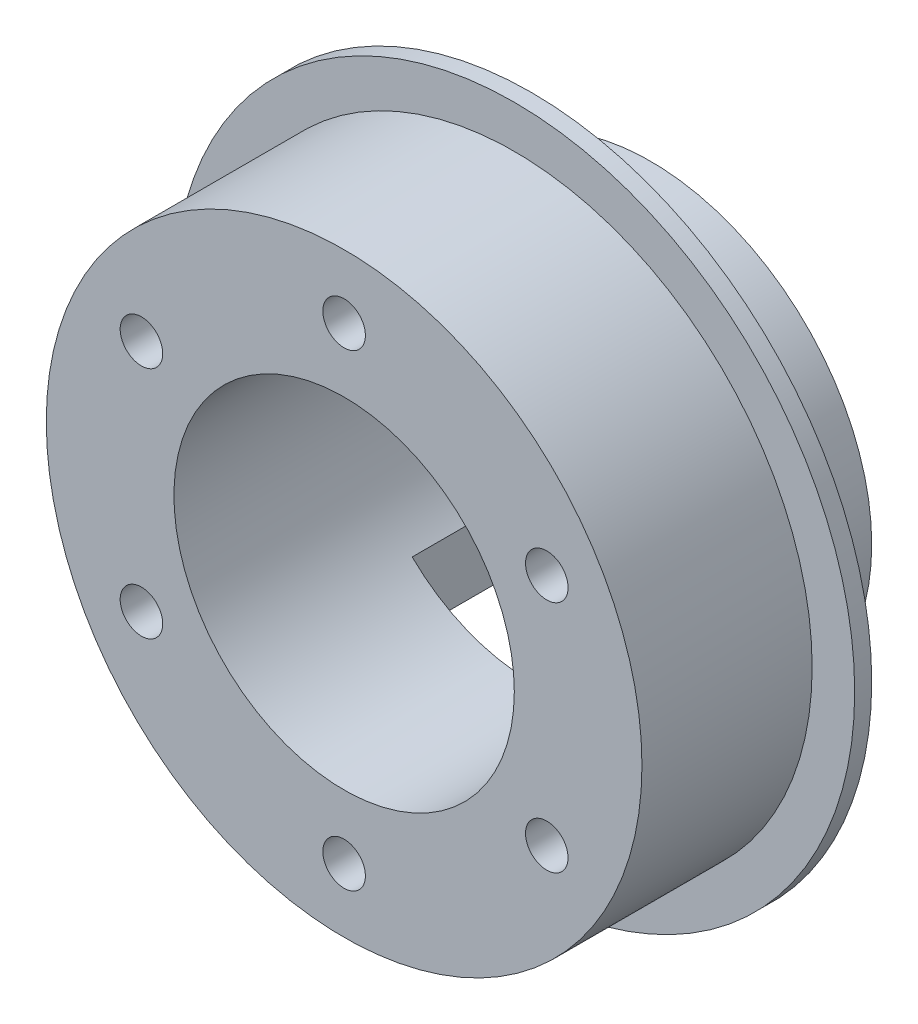
ISO-10303-21;
HEADER;
FILE_DESCRIPTION(('STEP AP214'),'2;1');
FILE_NAME('part.step','',(''),(''),'','','');
FILE_SCHEMA(('AUTOMOTIVE_DESIGN { 1 0 10303 214 1 1 1 1 }'));
ENDSEC;
DATA;
#1=APPLICATION_CONTEXT('core data for automotive mechanical design processes');
#2=APPLICATION_PROTOCOL_DEFINITION('international standard','automotive_design',2000,#1);
#3=PRODUCT_CONTEXT('',#1,'mechanical');
#4=PRODUCT('Part','Part','',(#3));
#5=PRODUCT_RELATED_PRODUCT_CATEGORY('part','',(#4));
#6=PRODUCT_DEFINITION_FORMATION('','',#4);
#7=PRODUCT_DEFINITION_CONTEXT('part definition',#1,'design');
#8=PRODUCT_DEFINITION('design','',#6,#7);
#9=PRODUCT_DEFINITION_SHAPE('','',#8);
#10=(LENGTH_UNIT() NAMED_UNIT(*) SI_UNIT(.MILLI.,.METRE.));
#11=(NAMED_UNIT(*) PLANE_ANGLE_UNIT() SI_UNIT($,.RADIAN.));
#12=(NAMED_UNIT(*) SI_UNIT($,.STERADIAN.) SOLID_ANGLE_UNIT());
#13=UNCERTAINTY_MEASURE_WITH_UNIT(LENGTH_MEASURE(1.E-05),#10,'distance_accuracy_value','');
#14=(GEOMETRIC_REPRESENTATION_CONTEXT(3) GLOBAL_UNCERTAINTY_ASSIGNED_CONTEXT((#13)) GLOBAL_UNIT_ASSIGNED_CONTEXT((#10,
#11,#12)) REPRESENTATION_CONTEXT('',''));
#15=CARTESIAN_POINT('',(0.,0.,0.));
#16=DIRECTION('',(0.,0.,1.));
#17=DIRECTION('',(1.,0.,0.));
#18=AXIS2_PLACEMENT_3D('',#15,#16,#17);
#19=CARTESIAN_POINT('',(0.,0.,8.));
#20=DIRECTION('',(0.,0.,1.));
#21=DIRECTION('',(1.,0.,0.));
#22=AXIS2_PLACEMENT_3D('',#19,#20,#21);
#23=PLANE('',#22);
#24=CARTESIAN_POINT('',(0.,0.,8.));
#25=DIRECTION('',(0.,0.,1.));
#26=DIRECTION('',(1.,0.,0.));
#27=AXIS2_PLACEMENT_3D('',#24,#25,#26);
#28=CIRCLE('',#27,17.5);
#29=CARTESIAN_POINT('',(17.5,0.,8.));
#30=VERTEX_POINT('',#29);
#31=EDGE_CURVE('E131',#30,#30,#28,.T.);
#32=ORIENTED_EDGE('',*,*,#31,.F.);
#33=EDGE_LOOP('',(#32));
#34=FACE_BOUND('',#33,.T.);
#35=CARTESIAN_POINT('',(0.,0.,8.));
#36=DIRECTION('',(0.,0.,1.));
#37=DIRECTION('',(1.,0.,0.));
#38=AXIS2_PLACEMENT_3D('',#35,#36,#37);
#39=CIRCLE('',#38,20.);
#40=CARTESIAN_POINT('',(20.,0.,8.));
#41=VERTEX_POINT('',#40);
#42=EDGE_CURVE('E314',#41,#41,#39,.T.);
#43=ORIENTED_EDGE('',*,*,#42,.T.);
#44=EDGE_LOOP('',(#43));
#45=FACE_BOUND('',#44,.T.);
#46=ADVANCED_FACE('F47',(#34,#45),#23,.T.);
#47=CARTESIAN_POINT('',(0.,0.,7.));
#48=DIRECTION('',(0.,0.,1.));
#49=DIRECTION('',(1.,0.,0.));
#50=AXIS2_PLACEMENT_3D('',#47,#48,#49);
#51=PLANE('',#50);
#52=DIRECTION('',(0.,1.,0.));
#53=VECTOR('',#52,1.);
#54=CARTESIAN_POINT('',(7.,-20.,7.));
#55=LINE('',#54,#53);
#56=CARTESIAN_POINT('',(7.,-10.9544511501033,7.));
#57=VERTEX_POINT('',#56);
#58=CARTESIAN_POINT('',(7.,-7.14142842854285,7.));
#59=VERTEX_POINT('',#58);
#60=EDGE_CURVE('E223',#57,#59,#55,.T.);
#61=ORIENTED_EDGE('',*,*,#60,.F.);
#62=CARTESIAN_POINT('',(0.,0.,7.));
#63=DIRECTION('',(0.,0.,1.));
#64=DIRECTION('',(1.,0.,0.));
#65=AXIS2_PLACEMENT_3D('',#62,#63,#64);
#66=CIRCLE('',#65,13.);
#67=CARTESIAN_POINT('',(7.,10.9544511501033,7.));
#68=VERTEX_POINT('',#67);
#69=EDGE_CURVE('E318',#57,#68,#66,.T.);
#70=ORIENTED_EDGE('',*,*,#69,.T.);
#71=CARTESIAN_POINT('',(7.,7.14142842854285,7.));
#72=VERTEX_POINT('',#71);
#73=EDGE_CURVE('E203',#72,#68,#55,.T.);
#74=ORIENTED_EDGE('',*,*,#73,.F.);
#75=CARTESIAN_POINT('',(0.,0.,7.));
#76=DIRECTION('',(0.,0.,1.));
#77=DIRECTION('',(1.,0.,0.));
#78=AXIS2_PLACEMENT_3D('',#75,#76,#77);
#79=CIRCLE('',#78,10.);
#80=CARTESIAN_POINT('',(-7.,7.14142842854285,7.));
#81=VERTEX_POINT('',#80);
#82=EDGE_CURVE('E56',#72,#81,#79,.T.);
#83=ORIENTED_EDGE('',*,*,#82,.T.);
#84=DIRECTION('',(0.,1.,0.));
#85=VECTOR('',#84,1.);
#86=CARTESIAN_POINT('',(-7.,-20.,7.));
#87=LINE('',#86,#85);
#88=CARTESIAN_POINT('',(-7.,10.9544511501033,7.));
#89=VERTEX_POINT('',#88);
#90=EDGE_CURVE('E117',#81,#89,#87,.T.);
#91=ORIENTED_EDGE('',*,*,#90,.T.);
#92=CARTESIAN_POINT('',(-7.,-10.9544511501033,7.));
#93=VERTEX_POINT('',#92);
#94=EDGE_CURVE('E322',#89,#93,#66,.T.);
#95=ORIENTED_EDGE('',*,*,#94,.T.);
#96=CARTESIAN_POINT('',(-7.,-7.14142842854285,7.));
#97=VERTEX_POINT('',#96);
#98=EDGE_CURVE('E208',#93,#97,#87,.T.);
#99=ORIENTED_EDGE('',*,*,#98,.T.);
#100=EDGE_CURVE('E129',#97,#59,#79,.T.);
#101=ORIENTED_EDGE('',*,*,#100,.T.);
#102=EDGE_LOOP('',(#61,#70,#74,#83,#91,#95,#99,#101));
#103=FACE_BOUND('',#102,.T.);
#104=CARTESIAN_POINT('',(0.,0.,7.));
#105=DIRECTION('',(0.,0.,1.));
#106=DIRECTION('',(1.,0.,0.));
#107=AXIS2_PLACEMENT_3D('',#104,#105,#106);
#108=CIRCLE('',#107,20.);
#109=CARTESIAN_POINT('',(20.,0.,7.));
#110=VERTEX_POINT('',#109);
#111=EDGE_CURVE('E312',#110,#110,#108,.T.);
#112=ORIENTED_EDGE('',*,*,#111,.F.);
#113=EDGE_LOOP('',(#112));
#114=FACE_BOUND('',#113,.T.);
#115=ADVANCED_FACE('F198',(#103,#114),#51,.F.);
#116=CARTESIAN_POINT('',(0.,0.,8.));
#117=DIRECTION('',(0.,0.,-1.));
#118=DIRECTION('',(-1.,0.,0.));
#119=AXIS2_PLACEMENT_3D('',#116,#117,#118);
#120=CYLINDRICAL_SURFACE('',#119,20.);
#121=ORIENTED_EDGE('',*,*,#42,.F.);
#122=EDGE_LOOP('',(#121));
#123=FACE_BOUND('',#122,.T.);
#124=ORIENTED_EDGE('',*,*,#111,.T.);
#125=EDGE_LOOP('',(#124));
#126=FACE_BOUND('',#125,.T.);
#127=ADVANCED_FACE('F332',(#123,#126),#120,.T.);
#128=CARTESIAN_POINT('',(0.,0.,0.));
#129=DIRECTION('',(0.,0.,1.));
#130=DIRECTION('',(1.,0.,0.));
#131=AXIS2_PLACEMENT_3D('',#128,#129,#130);
#132=PLANE('',#131);
#133=CARTESIAN_POINT('',(0.,7.,0.));
#134=DIRECTION('',(0.,0.,-1.));
#135=DIRECTION('',(-1.,0.,0.));
#136=AXIS2_PLACEMENT_3D('',#133,#134,#135);
#137=CIRCLE('',#136,1.);
#138=CARTESIAN_POINT('',(-1.,7.,0.));
#139=VERTEX_POINT('',#138);
#140=EDGE_CURVE('E156',#139,#139,#137,.T.);
#141=ORIENTED_EDGE('',*,*,#140,.F.);
#142=EDGE_LOOP('',(#141));
#143=FACE_BOUND('',#142,.T.);
#144=CARTESIAN_POINT('',(0.,0.,0.));
#145=DIRECTION('',(0.,0.,-1.));
#146=DIRECTION('',(-1.,0.,0.));
#147=AXIS2_PLACEMENT_3D('',#144,#145,#146);
#148=CIRCLE('',#147,3.);
#149=CARTESIAN_POINT('',(-3.,0.,0.));
#150=VERTEX_POINT('',#149);
#151=EDGE_CURVE('E239',#150,#150,#148,.T.);
#152=ORIENTED_EDGE('',*,*,#151,.F.);
#153=EDGE_LOOP('',(#152));
#154=FACE_BOUND('',#153,.T.);
#155=CARTESIAN_POINT('',(0.,-7.,0.));
#156=DIRECTION('',(0.,0.,-1.));
#157=DIRECTION('',(-1.,0.,0.));
#158=AXIS2_PLACEMENT_3D('',#155,#156,#157);
#159=CIRCLE('',#158,1.);
#160=CARTESIAN_POINT('',(-1.,-7.,0.));
#161=VERTEX_POINT('',#160);
#162=EDGE_CURVE('E243',#161,#161,#159,.T.);
#163=ORIENTED_EDGE('',*,*,#162,.F.);
#164=EDGE_LOOP('',(#163));
#165=FACE_BOUND('',#164,.T.);
#166=CARTESIAN_POINT('',(7.,3.,0.));
#167=DIRECTION('',(0.,0.,-1.));
#168=DIRECTION('',(-1.,0.,0.));
#169=AXIS2_PLACEMENT_3D('',#166,#167,#168);
#170=CIRCLE('',#169,1.);
#171=CARTESIAN_POINT('',(6.,3.,0.));
#172=VERTEX_POINT('',#171);
#173=EDGE_CURVE('E247',#172,#172,#170,.T.);
#174=ORIENTED_EDGE('',*,*,#173,.F.);
#175=EDGE_LOOP('',(#174));
#176=FACE_BOUND('',#175,.T.);
#177=CARTESIAN_POINT('',(7.,-3.,0.));
#178=DIRECTION('',(0.,0.,-1.));
#179=DIRECTION('',(-1.,0.,0.));
#180=AXIS2_PLACEMENT_3D('',#177,#178,#179);
#181=CIRCLE('',#180,1.);
#182=CARTESIAN_POINT('',(6.,-3.,0.));
#183=VERTEX_POINT('',#182);
#184=EDGE_CURVE('E251',#183,#183,#181,.T.);
#185=ORIENTED_EDGE('',*,*,#184,.F.);
#186=EDGE_LOOP('',(#185));
#187=FACE_BOUND('',#186,.T.);
#188=CARTESIAN_POINT('',(-7.,3.,0.));
#189=DIRECTION('',(0.,0.,-1.));
#190=DIRECTION('',(-1.,0.,0.));
#191=AXIS2_PLACEMENT_3D('',#188,#189,#190);
#192=CIRCLE('',#191,1.);
#193=CARTESIAN_POINT('',(-8.,3.,0.));
#194=VERTEX_POINT('',#193);
#195=EDGE_CURVE('E255',#194,#194,#192,.T.);
#196=ORIENTED_EDGE('',*,*,#195,.F.);
#197=EDGE_LOOP('',(#196));
#198=FACE_BOUND('',#197,.T.);
#199=CARTESIAN_POINT('',(-7.,-3.,0.));
#200=DIRECTION('',(0.,0.,-1.));
#201=DIRECTION('',(-1.,0.,0.));
#202=AXIS2_PLACEMENT_3D('',#199,#200,#201);
#203=CIRCLE('',#202,1.);
#204=CARTESIAN_POINT('',(-8.,-3.,0.));
#205=VERTEX_POINT('',#204);
#206=EDGE_CURVE('E235',#205,#205,#203,.T.);
#207=ORIENTED_EDGE('',*,*,#206,.F.);
#208=EDGE_LOOP('',(#207));
#209=FACE_BOUND('',#208,.T.);
#210=CARTESIAN_POINT('',(0.,0.,0.));
#211=DIRECTION('',(0.,0.,1.));
#212=DIRECTION('',(1.,0.,0.));
#213=AXIS2_PLACEMENT_3D('',#210,#211,#212);
#214=CIRCLE('',#213,13.);
#215=CARTESIAN_POINT('',(13.,0.,0.));
#216=VERTEX_POINT('',#215);
#217=EDGE_CURVE('E147',#216,#216,#214,.T.);
#218=ORIENTED_EDGE('',*,*,#217,.F.);
#219=EDGE_LOOP('',(#218));
#220=FACE_BOUND('',#219,.T.);
#221=ADVANCED_FACE('F330',(#143,#154,#165,#176,#187,#198,#209,#220),#132,.F.);
#222=CARTESIAN_POINT('',(0.,0.,2.));
#223=DIRECTION('',(0.,0.,-1.));
#224=DIRECTION('',(-1.,0.,0.));
#225=AXIS2_PLACEMENT_3D('',#222,#223,#224);
#226=CYLINDRICAL_SURFACE('',#225,13.);
#227=CARTESIAN_POINT('',(0.,0.,2.));
#228=DIRECTION('',(0.,0.,-1.));
#229=DIRECTION('',(-1.,0.,0.));
#230=AXIS2_PLACEMENT_3D('',#227,#228,#229);
#231=CIRCLE('',#230,13.);
#232=CARTESIAN_POINT('',(-7.,10.9544511501033,2.));
#233=VERTEX_POINT('',#232);
#234=CARTESIAN_POINT('',(7.,10.9544511501033,2.));
#235=VERTEX_POINT('',#234);
#236=EDGE_CURVE('E222',#233,#235,#231,.T.);
#237=ORIENTED_EDGE('',*,*,#236,.T.);
#238=DIRECTION('',(0.,0.,-1.));
#239=VECTOR('',#238,1.);
#240=CARTESIAN_POINT('',(7.,10.9544511501033,2.));
#241=LINE('',#240,#239);
#242=EDGE_CURVE('E228',#235,#68,#241,.F.);
#243=ORIENTED_EDGE('',*,*,#242,.T.);
#244=ORIENTED_EDGE('',*,*,#69,.F.);
#245=DIRECTION('',(0.,0.,-1.));
#246=VECTOR('',#245,1.);
#247=CARTESIAN_POINT('',(7.,-10.9544511501033,2.));
#248=LINE('',#247,#246);
#249=CARTESIAN_POINT('',(7.,-10.9544511501033,2.));
#250=VERTEX_POINT('',#249);
#251=EDGE_CURVE('E231',#57,#250,#248,.T.);
#252=ORIENTED_EDGE('',*,*,#251,.T.);
#253=CARTESIAN_POINT('',(-7.,-10.9544511501033,2.));
#254=VERTEX_POINT('',#253);
#255=EDGE_CURVE('E219',#250,#254,#231,.T.);
#256=ORIENTED_EDGE('',*,*,#255,.T.);
#257=DIRECTION('',(0.,0.,-1.));
#258=VECTOR('',#257,1.);
#259=CARTESIAN_POINT('',(-7.,-10.9544511501033,2.));
#260=LINE('',#259,#258);
#261=EDGE_CURVE('E114',#254,#93,#260,.F.);
#262=ORIENTED_EDGE('',*,*,#261,.T.);
#263=ORIENTED_EDGE('',*,*,#94,.F.);
#264=DIRECTION('',(0.,0.,-1.));
#265=VECTOR('',#264,1.);
#266=CARTESIAN_POINT('',(-7.,10.9544511501033,2.));
#267=LINE('',#266,#265);
#268=EDGE_CURVE('E206',#89,#233,#267,.T.);
#269=ORIENTED_EDGE('',*,*,#268,.T.);
#270=EDGE_LOOP('',(#237,#243,#244,#252,#256,#262,#263,#269));
#271=FACE_BOUND('',#270,.T.);
#272=ORIENTED_EDGE('',*,*,#217,.T.);
#273=EDGE_LOOP('',(#272));
#274=FACE_BOUND('',#273,.T.);
#275=ADVANCED_FACE('F49',(#271,#274),#226,.T.);
#276=CARTESIAN_POINT('',(0.,0.,18.));
#277=DIRECTION('',(0.,0.,1.));
#278=DIRECTION('',(1.,0.,0.));
#279=AXIS2_PLACEMENT_3D('',#276,#277,#278);
#280=PLANE('',#279);
#281=CARTESIAN_POINT('',(0.,13.75,18.));
#282=DIRECTION('',(0.,0.,1.));
#283=DIRECTION('',(1.,0.,0.));
#284=AXIS2_PLACEMENT_3D('',#281,#282,#283);
#285=CIRCLE('',#284,1.25);
#286=CARTESIAN_POINT('',(1.25,13.75,18.));
#287=VERTEX_POINT('',#286);
#288=EDGE_CURVE('E267',#287,#287,#285,.T.);
#289=ORIENTED_EDGE('',*,*,#288,.F.);
#290=EDGE_LOOP('',(#289));
#291=FACE_BOUND('',#290,.T.);
#292=CARTESIAN_POINT('',(-11.907849302036,6.87500000000014,18.));
#293=DIRECTION('',(0.,0.,1.));
#294=DIRECTION('',(1.,0.,0.));
#295=AXIS2_PLACEMENT_3D('',#292,#293,#294);
#296=CIRCLE('',#295,1.25);
#297=CARTESIAN_POINT('',(-10.657849302036,6.87500000000014,18.));
#298=VERTEX_POINT('',#297);
#299=EDGE_CURVE('E272',#298,#298,#296,.T.);
#300=ORIENTED_EDGE('',*,*,#299,.F.);
#301=EDGE_LOOP('',(#300));
#302=FACE_BOUND('',#301,.T.);
#303=CARTESIAN_POINT('',(-11.9078493020361,-6.87499999999989,18.));
#304=DIRECTION('',(0.,0.,1.));
#305=DIRECTION('',(1.,0.,0.));
#306=AXIS2_PLACEMENT_3D('',#303,#304,#305);
#307=CIRCLE('',#306,1.25);
#308=CARTESIAN_POINT('',(-10.6578493020361,-6.87499999999989,18.));
#309=VERTEX_POINT('',#308);
#310=EDGE_CURVE('E300',#309,#309,#307,.T.);
#311=ORIENTED_EDGE('',*,*,#310,.F.);
#312=EDGE_LOOP('',(#311));
#313=FACE_BOUND('',#312,.T.);
#314=CARTESIAN_POINT('',(0.,-13.75,18.));
#315=DIRECTION('',(0.,0.,1.));
#316=DIRECTION('',(1.,0.,0.));
#317=AXIS2_PLACEMENT_3D('',#314,#315,#316);
#318=CIRCLE('',#317,1.25);
#319=CARTESIAN_POINT('',(1.2499999999999,-13.75,18.));
#320=VERTEX_POINT('',#319);
#321=EDGE_CURVE('E294',#320,#320,#318,.T.);
#322=ORIENTED_EDGE('',*,*,#321,.F.);
#323=EDGE_LOOP('',(#322));
#324=FACE_BOUND('',#323,.T.);
#325=CARTESIAN_POINT('',(11.907849302036,-6.87500000000006,18.));
#326=DIRECTION('',(0.,0.,1.));
#327=DIRECTION('',(1.,0.,0.));
#328=AXIS2_PLACEMENT_3D('',#325,#326,#327);
#329=CIRCLE('',#328,1.25);
#330=CARTESIAN_POINT('',(13.157849302036,-6.87500000000006,18.));
#331=VERTEX_POINT('',#330);
#332=EDGE_CURVE('E286',#331,#331,#329,.T.);
#333=ORIENTED_EDGE('',*,*,#332,.F.);
#334=EDGE_LOOP('',(#333));
#335=FACE_BOUND('',#334,.T.);
#336=CARTESIAN_POINT('',(11.907849302036,6.87499999999997,18.));
#337=DIRECTION('',(0.,0.,1.));
#338=DIRECTION('',(1.,0.,0.));
#339=AXIS2_PLACEMENT_3D('',#336,#337,#338);
#340=CIRCLE('',#339,1.25);
#341=CARTESIAN_POINT('',(13.157849302036,6.87499999999997,18.));
#342=VERTEX_POINT('',#341);
#343=EDGE_CURVE('E271',#342,#342,#340,.T.);
#344=ORIENTED_EDGE('',*,*,#343,.F.);
#345=EDGE_LOOP('',(#344));
#346=FACE_BOUND('',#345,.T.);
#347=CARTESIAN_POINT('',(0.,0.,18.));
#348=DIRECTION('',(0.,0.,1.));
#349=DIRECTION('',(1.,0.,0.));
#350=AXIS2_PLACEMENT_3D('',#347,#348,#349);
#351=CIRCLE('',#350,17.5);
#352=CARTESIAN_POINT('',(17.5,0.,18.));
#353=VERTEX_POINT('',#352);
#354=EDGE_CURVE('E309',#353,#353,#351,.T.);
#355=ORIENTED_EDGE('',*,*,#354,.T.);
#356=EDGE_LOOP('',(#355));
#357=FACE_BOUND('',#356,.T.);
#358=CARTESIAN_POINT('',(0.,0.,18.));
#359=DIRECTION('',(0.,0.,1.));
#360=DIRECTION('',(1.,0.,0.));
#361=AXIS2_PLACEMENT_3D('',#358,#359,#360);
#362=CIRCLE('',#361,10.);
#363=CARTESIAN_POINT('',(10.,0.,18.));
#364=VERTEX_POINT('',#363);
#365=EDGE_CURVE('E266',#364,#364,#362,.T.);
#366=ORIENTED_EDGE('',*,*,#365,.F.);
#367=EDGE_LOOP('',(#366));
#368=FACE_BOUND('',#367,.T.);
#369=ADVANCED_FACE('F337',(#291,#302,#313,#324,#335,#346,#357,#368),#280,.T.);
#370=CARTESIAN_POINT('',(0.,0.,18.));
#371=DIRECTION('',(0.,0.,-1.));
#372=DIRECTION('',(-1.,0.,0.));
#373=AXIS2_PLACEMENT_3D('',#370,#371,#372);
#374=CYLINDRICAL_SURFACE('',#373,17.5);
#375=ORIENTED_EDGE('',*,*,#354,.F.);
#376=EDGE_LOOP('',(#375));
#377=FACE_BOUND('',#376,.T.);
#378=ORIENTED_EDGE('',*,*,#31,.T.);
#379=EDGE_LOOP('',(#378));
#380=FACE_BOUND('',#379,.T.);
#381=ADVANCED_FACE('F353',(#377,#380),#374,.T.);
#382=CARTESIAN_POINT('',(0.,0.,2.));
#383=DIRECTION('',(0.,0.,1.));
#384=DIRECTION('',(1.,0.,0.));
#385=AXIS2_PLACEMENT_3D('',#382,#383,#384);
#386=PLANE('',#385);
#387=CARTESIAN_POINT('',(7.,-3.,2.));
#388=DIRECTION('',(0.,0.,1.));
#389=DIRECTION('',(1.,0.,0.));
#390=AXIS2_PLACEMENT_3D('',#387,#388,#389);
#391=CIRCLE('',#390,1.);
#392=CARTESIAN_POINT('',(8.,-3.,2.));
#393=VERTEX_POINT('',#392);
#394=EDGE_CURVE('E160',#393,#393,#391,.T.);
#395=ORIENTED_EDGE('',*,*,#394,.F.);
#396=EDGE_LOOP('',(#395));
#397=FACE_BOUND('',#396,.T.);
#398=CARTESIAN_POINT('',(7.,3.,2.));
#399=DIRECTION('',(0.,0.,1.));
#400=DIRECTION('',(1.,0.,0.));
#401=AXIS2_PLACEMENT_3D('',#398,#399,#400);
#402=CIRCLE('',#401,1.);
#403=CARTESIAN_POINT('',(8.,3.,2.));
#404=VERTEX_POINT('',#403);
#405=EDGE_CURVE('E164',#404,#404,#402,.T.);
#406=ORIENTED_EDGE('',*,*,#405,.F.);
#407=EDGE_LOOP('',(#406));
#408=FACE_BOUND('',#407,.T.);
#409=CARTESIAN_POINT('',(-7.,3.,2.));
#410=DIRECTION('',(0.,0.,1.));
#411=DIRECTION('',(1.,0.,0.));
#412=AXIS2_PLACEMENT_3D('',#409,#410,#411);
#413=CIRCLE('',#412,1.);
#414=CARTESIAN_POINT('',(-6.,3.,2.));
#415=VERTEX_POINT('',#414);
#416=EDGE_CURVE('E155',#415,#415,#413,.T.);
#417=ORIENTED_EDGE('',*,*,#416,.F.);
#418=EDGE_LOOP('',(#417));
#419=FACE_BOUND('',#418,.T.);
#420=CARTESIAN_POINT('',(-7.,-3.,2.));
#421=DIRECTION('',(0.,0.,1.));
#422=DIRECTION('',(1.,0.,0.));
#423=AXIS2_PLACEMENT_3D('',#420,#421,#422);
#424=CIRCLE('',#423,1.);
#425=CARTESIAN_POINT('',(-6.,-3.,2.));
#426=VERTEX_POINT('',#425);
#427=EDGE_CURVE('E151',#426,#426,#424,.T.);
#428=ORIENTED_EDGE('',*,*,#427,.F.);
#429=EDGE_LOOP('',(#428));
#430=FACE_BOUND('',#429,.T.);
#431=DIRECTION('',(0.,1.,0.));
#432=VECTOR('',#431,1.);
#433=CARTESIAN_POINT('',(-7.,-20.,2.));
#434=LINE('',#433,#432);
#435=CARTESIAN_POINT('',(-7.,7.14142842854285,2.));
#436=VERTEX_POINT('',#435);
#437=EDGE_CURVE('E118',#436,#233,#434,.T.);
#438=ORIENTED_EDGE('',*,*,#437,.F.);
#439=CARTESIAN_POINT('',(0.,0.,2.));
#440=DIRECTION('',(0.,0.,1.));
#441=DIRECTION('',(1.,0.,0.));
#442=AXIS2_PLACEMENT_3D('',#439,#440,#441);
#443=CIRCLE('',#442,10.);
#444=CARTESIAN_POINT('',(-7.,-7.14142842854285,2.));
#445=VERTEX_POINT('',#444);
#446=EDGE_CURVE('E127',#445,#436,#443,.F.);
#447=ORIENTED_EDGE('',*,*,#446,.F.);
#448=EDGE_CURVE('E70',#254,#445,#434,.T.);
#449=ORIENTED_EDGE('',*,*,#448,.F.);
#450=ORIENTED_EDGE('',*,*,#255,.F.);
#451=DIRECTION('',(0.,1.,0.));
#452=VECTOR('',#451,1.);
#453=CARTESIAN_POINT('',(7.,-20.,2.));
#454=LINE('',#453,#452);
#455=CARTESIAN_POINT('',(7.,-7.14142842854285,2.));
#456=VERTEX_POINT('',#455);
#457=EDGE_CURVE('E216',#250,#456,#454,.T.);
#458=ORIENTED_EDGE('',*,*,#457,.T.);
#459=CARTESIAN_POINT('',(7.,7.14142842854285,2.));
#460=VERTEX_POINT('',#459);
#461=EDGE_CURVE('E138',#460,#456,#443,.F.);
#462=ORIENTED_EDGE('',*,*,#461,.F.);
#463=EDGE_CURVE('E63',#460,#235,#454,.T.);
#464=ORIENTED_EDGE('',*,*,#463,.T.);
#465=ORIENTED_EDGE('',*,*,#236,.F.);
#466=EDGE_LOOP('',(#438,#447,#449,#450,#458,#462,#464,#465));
#467=FACE_BOUND('',#466,.T.);
#468=CARTESIAN_POINT('',(0.,7.,2.));
#469=DIRECTION('',(0.,0.,1.));
#470=DIRECTION('',(1.,0.,0.));
#471=AXIS2_PLACEMENT_3D('',#468,#469,#470);
#472=CIRCLE('',#471,1.);
#473=CARTESIAN_POINT('',(1.,7.,2.));
#474=VERTEX_POINT('',#473);
#475=EDGE_CURVE('E176',#474,#474,#472,.T.);
#476=ORIENTED_EDGE('',*,*,#475,.F.);
#477=EDGE_LOOP('',(#476));
#478=FACE_BOUND('',#477,.T.);
#479=CARTESIAN_POINT('',(0.,0.,2.));
#480=DIRECTION('',(0.,0.,1.));
#481=DIRECTION('',(1.,0.,0.));
#482=AXIS2_PLACEMENT_3D('',#479,#480,#481);
#483=CIRCLE('',#482,3.);
#484=CARTESIAN_POINT('',(3.,0.,2.));
#485=VERTEX_POINT('',#484);
#486=EDGE_CURVE('E172',#485,#485,#483,.T.);
#487=ORIENTED_EDGE('',*,*,#486,.F.);
#488=EDGE_LOOP('',(#487));
#489=FACE_BOUND('',#488,.T.);
#490=CARTESIAN_POINT('',(0.,-7.,2.));
#491=DIRECTION('',(0.,0.,1.));
#492=DIRECTION('',(1.,0.,0.));
#493=AXIS2_PLACEMENT_3D('',#490,#491,#492);
#494=CIRCLE('',#493,1.);
#495=CARTESIAN_POINT('',(1.,-7.,2.));
#496=VERTEX_POINT('',#495);
#497=EDGE_CURVE('E168',#496,#496,#494,.T.);
#498=ORIENTED_EDGE('',*,*,#497,.F.);
#499=EDGE_LOOP('',(#498));
#500=FACE_BOUND('',#499,.T.);
#501=ADVANCED_FACE('F133',(#397,#408,#419,#430,#467,#478,#489,#500),#386,.T.);
#502=CARTESIAN_POINT('',(0.,0.,7.));
#503=DIRECTION('',(0.,0.,-1.));
#504=DIRECTION('',(-1.,0.,0.));
#505=AXIS2_PLACEMENT_3D('',#502,#503,#504);
#506=CYLINDRICAL_SURFACE('',#505,10.);
#507=DIRECTION('',(0.,0.,-1.));
#508=VECTOR('',#507,1.);
#509=CARTESIAN_POINT('',(7.,7.14142842854285,7.));
#510=LINE('',#509,#508);
#511=EDGE_CURVE('E11',#460,#72,#510,.F.);
#512=ORIENTED_EDGE('',*,*,#511,.F.);
#513=ORIENTED_EDGE('',*,*,#461,.T.);
#514=DIRECTION('',(0.,0.,-1.));
#515=VECTOR('',#514,1.);
#516=CARTESIAN_POINT('',(7.,-7.14142842854285,7.));
#517=LINE('',#516,#515);
#518=EDGE_CURVE('E183',#59,#456,#517,.T.);
#519=ORIENTED_EDGE('',*,*,#518,.F.);
#520=ORIENTED_EDGE('',*,*,#100,.F.);
#521=DIRECTION('',(0.,0.,-1.));
#522=VECTOR('',#521,1.);
#523=CARTESIAN_POINT('',(-7.,-7.14142842854285,7.));
#524=LINE('',#523,#522);
#525=EDGE_CURVE('E111',#445,#97,#524,.F.);
#526=ORIENTED_EDGE('',*,*,#525,.F.);
#527=ORIENTED_EDGE('',*,*,#446,.T.);
#528=DIRECTION('',(0.,0.,-1.));
#529=VECTOR('',#528,1.);
#530=CARTESIAN_POINT('',(-7.,7.14142842854285,7.));
#531=LINE('',#530,#529);
#532=EDGE_CURVE('E186',#81,#436,#531,.T.);
#533=ORIENTED_EDGE('',*,*,#532,.F.);
#534=ORIENTED_EDGE('',*,*,#82,.F.);
#535=EDGE_LOOP('',(#512,#513,#519,#520,#526,#527,#533,#534));
#536=FACE_BOUND('',#535,.T.);
#537=ORIENTED_EDGE('',*,*,#365,.T.);
#538=EDGE_LOOP('',(#537));
#539=FACE_BOUND('',#538,.T.);
#540=ADVANCED_FACE('F124',(#536,#539),#506,.F.);
#541=CARTESIAN_POINT('',(11.907849302036,6.87499999999997,10.));
#542=DIRECTION('',(0.,0.,1.));
#543=DIRECTION('',(1.,0.,0.));
#544=AXIS2_PLACEMENT_3D('',#541,#542,#543);
#545=CYLINDRICAL_SURFACE('',#544,1.25);
#546=CARTESIAN_POINT('',(11.907849302036,6.87499999999997,10.));
#547=DIRECTION('',(0.,0.,1.));
#548=DIRECTION('',(1.,0.,0.));
#549=AXIS2_PLACEMENT_3D('',#546,#547,#548);
#550=CIRCLE('',#549,1.25);
#551=CARTESIAN_POINT('',(13.157849302036,6.87499999999997,10.));
#552=VERTEX_POINT('',#551);
#553=EDGE_CURVE('E282',#552,#552,#550,.T.);
#554=ORIENTED_EDGE('',*,*,#553,.F.);
#555=EDGE_LOOP('',(#554));
#556=FACE_BOUND('',#555,.T.);
#557=ORIENTED_EDGE('',*,*,#343,.T.);
#558=EDGE_LOOP('',(#557));
#559=FACE_BOUND('',#558,.T.);
#560=ADVANCED_FACE('F357',(#556,#559),#545,.F.);
#561=CARTESIAN_POINT('',(11.907849302036,6.87499999999997,10.));
#562=DIRECTION('',(0.,0.,1.));
#563=DIRECTION('',(1.,0.,0.));
#564=AXIS2_PLACEMENT_3D('',#561,#562,#563);
#565=PLANE('',#564);
#566=ORIENTED_EDGE('',*,*,#553,.T.);
#567=EDGE_LOOP('',(#566));
#568=FACE_BOUND('',#567,.T.);
#569=ADVANCED_FACE('F404',(#568),#565,.T.);
#570=CARTESIAN_POINT('',(11.907849302036,-6.87500000000006,10.));
#571=DIRECTION('',(0.,0.,1.));
#572=DIRECTION('',(1.,0.,0.));
#573=AXIS2_PLACEMENT_3D('',#570,#571,#572);
#574=CYLINDRICAL_SURFACE('',#573,1.25);
#575=CARTESIAN_POINT('',(11.907849302036,-6.87500000000006,10.));
#576=DIRECTION('',(0.,0.,1.));
#577=DIRECTION('',(1.,0.,0.));
#578=AXIS2_PLACEMENT_3D('',#575,#576,#577);
#579=CIRCLE('',#578,1.25);
#580=CARTESIAN_POINT('',(13.157849302036,-6.87500000000006,10.));
#581=VERTEX_POINT('',#580);
#582=EDGE_CURVE('E290',#581,#581,#579,.T.);
#583=ORIENTED_EDGE('',*,*,#582,.F.);
#584=EDGE_LOOP('',(#583));
#585=FACE_BOUND('',#584,.T.);
#586=ORIENTED_EDGE('',*,*,#332,.T.);
#587=EDGE_LOOP('',(#586));
#588=FACE_BOUND('',#587,.T.);
#589=ADVANCED_FACE('F408',(#585,#588),#574,.F.);
#590=CARTESIAN_POINT('',(11.907849302036,-6.87500000000006,10.));
#591=DIRECTION('',(0.,0.,1.));
#592=DIRECTION('',(1.,0.,0.));
#593=AXIS2_PLACEMENT_3D('',#590,#591,#592);
#594=PLANE('',#593);
#595=ORIENTED_EDGE('',*,*,#582,.T.);
#596=EDGE_LOOP('',(#595));
#597=FACE_BOUND('',#596,.T.);
#598=ADVANCED_FACE('F412',(#597),#594,.T.);
#599=CARTESIAN_POINT('',(0.,-13.75,10.));
#600=DIRECTION('',(0.,0.,1.));
#601=DIRECTION('',(1.,0.,0.));
#602=AXIS2_PLACEMENT_3D('',#599,#600,#601);
#603=CYLINDRICAL_SURFACE('',#602,1.25);
#604=CARTESIAN_POINT('',(0.,-13.75,10.));
#605=DIRECTION('',(0.,0.,1.));
#606=DIRECTION('',(1.,0.,0.));
#607=AXIS2_PLACEMENT_3D('',#604,#605,#606);
#608=CIRCLE('',#607,1.25);
#609=CARTESIAN_POINT('',(1.2499999999999,-13.75,10.));
#610=VERTEX_POINT('',#609);
#611=EDGE_CURVE('E297',#610,#610,#608,.T.);
#612=ORIENTED_EDGE('',*,*,#611,.F.);
#613=EDGE_LOOP('',(#612));
#614=FACE_BOUND('',#613,.T.);
#615=ORIENTED_EDGE('',*,*,#321,.T.);
#616=EDGE_LOOP('',(#615));
#617=FACE_BOUND('',#616,.T.);
#618=ADVANCED_FACE('F416',(#614,#617),#603,.F.);
#619=CARTESIAN_POINT('',(0.,-13.75,10.));
#620=DIRECTION('',(0.,0.,1.));
#621=DIRECTION('',(1.,0.,0.));
#622=AXIS2_PLACEMENT_3D('',#619,#620,#621);
#623=PLANE('',#622);
#624=ORIENTED_EDGE('',*,*,#611,.T.);
#625=EDGE_LOOP('',(#624));
#626=FACE_BOUND('',#625,.T.);
#627=ADVANCED_FACE('F420',(#626),#623,.T.);
#628=CARTESIAN_POINT('',(-11.9078493020361,-6.87499999999989,10.));
#629=DIRECTION('',(0.,0.,1.));
#630=DIRECTION('',(1.,0.,0.));
#631=AXIS2_PLACEMENT_3D('',#628,#629,#630);
#632=CYLINDRICAL_SURFACE('',#631,1.25);
#633=CARTESIAN_POINT('',(-11.9078493020361,-6.87499999999989,10.));
#634=DIRECTION('',(0.,0.,1.));
#635=DIRECTION('',(1.,0.,0.));
#636=AXIS2_PLACEMENT_3D('',#633,#634,#635);
#637=CIRCLE('',#636,1.25);
#638=CARTESIAN_POINT('',(-10.6578493020361,-6.87499999999989,10.));
#639=VERTEX_POINT('',#638);
#640=EDGE_CURVE('E275',#639,#639,#637,.T.);
#641=ORIENTED_EDGE('',*,*,#640,.F.);
#642=EDGE_LOOP('',(#641));
#643=FACE_BOUND('',#642,.T.);
#644=ORIENTED_EDGE('',*,*,#310,.T.);
#645=EDGE_LOOP('',(#644));
#646=FACE_BOUND('',#645,.T.);
#647=ADVANCED_FACE('F424',(#643,#646),#632,.F.);
#648=CARTESIAN_POINT('',(-11.9078493020361,-6.87499999999989,10.));
#649=DIRECTION('',(0.,0.,1.));
#650=DIRECTION('',(1.,0.,0.));
#651=AXIS2_PLACEMENT_3D('',#648,#649,#650);
#652=PLANE('',#651);
#653=ORIENTED_EDGE('',*,*,#640,.T.);
#654=EDGE_LOOP('',(#653));
#655=FACE_BOUND('',#654,.T.);
#656=ADVANCED_FACE('F397',(#655),#652,.T.);
#657=CARTESIAN_POINT('',(-11.907849302036,6.87500000000014,10.));
#658=DIRECTION('',(0.,0.,1.));
#659=DIRECTION('',(1.,0.,0.));
#660=AXIS2_PLACEMENT_3D('',#657,#658,#659);
#661=CYLINDRICAL_SURFACE('',#660,1.25);
#662=CARTESIAN_POINT('',(-11.907849302036,6.87500000000014,10.));
#663=DIRECTION('',(0.,0.,1.));
#664=DIRECTION('',(1.,0.,0.));
#665=AXIS2_PLACEMENT_3D('',#662,#663,#664);
#666=CIRCLE('',#665,1.25);
#667=CARTESIAN_POINT('',(-10.657849302036,6.87500000000014,10.));
#668=VERTEX_POINT('',#667);
#669=EDGE_CURVE('E179',#668,#668,#666,.T.);
#670=ORIENTED_EDGE('',*,*,#669,.F.);
#671=EDGE_LOOP('',(#670));
#672=FACE_BOUND('',#671,.T.);
#673=ORIENTED_EDGE('',*,*,#299,.T.);
#674=EDGE_LOOP('',(#673));
#675=FACE_BOUND('',#674,.T.);
#676=ADVANCED_FACE('F394',(#672,#675),#661,.F.);
#677=CARTESIAN_POINT('',(-11.907849302036,6.87500000000014,10.));
#678=DIRECTION('',(0.,0.,1.));
#679=DIRECTION('',(1.,0.,0.));
#680=AXIS2_PLACEMENT_3D('',#677,#678,#679);
#681=PLANE('',#680);
#682=ORIENTED_EDGE('',*,*,#669,.T.);
#683=EDGE_LOOP('',(#682));
#684=FACE_BOUND('',#683,.T.);
#685=ADVANCED_FACE('F392',(#684),#681,.T.);
#686=CARTESIAN_POINT('',(0.,13.75,10.));
#687=DIRECTION('',(0.,0.,1.));
#688=DIRECTION('',(1.,0.,0.));
#689=AXIS2_PLACEMENT_3D('',#686,#687,#688);
#690=CYLINDRICAL_SURFACE('',#689,1.25);
#691=CARTESIAN_POINT('',(0.,13.75,10.));
#692=DIRECTION('',(0.,0.,1.));
#693=DIRECTION('',(1.,0.,0.));
#694=AXIS2_PLACEMENT_3D('',#691,#692,#693);
#695=CIRCLE('',#694,1.25);
#696=CARTESIAN_POINT('',(1.25,13.75,10.));
#697=VERTEX_POINT('',#696);
#698=EDGE_CURVE('E262',#697,#697,#695,.T.);
#699=ORIENTED_EDGE('',*,*,#698,.F.);
#700=EDGE_LOOP('',(#699));
#701=FACE_BOUND('',#700,.T.);
#702=ORIENTED_EDGE('',*,*,#288,.T.);
#703=EDGE_LOOP('',(#702));
#704=FACE_BOUND('',#703,.T.);
#705=ADVANCED_FACE('F385',(#701,#704),#690,.F.);
#706=CARTESIAN_POINT('',(0.,13.75,10.));
#707=DIRECTION('',(0.,0.,1.));
#708=DIRECTION('',(1.,0.,0.));
#709=AXIS2_PLACEMENT_3D('',#706,#707,#708);
#710=PLANE('',#709);
#711=ORIENTED_EDGE('',*,*,#698,.T.);
#712=EDGE_LOOP('',(#711));
#713=FACE_BOUND('',#712,.T.);
#714=ADVANCED_FACE('F375',(#713),#710,.T.);
#715=CARTESIAN_POINT('',(-7.,-3.,18.));
#716=DIRECTION('',(0.,0.,-1.));
#717=DIRECTION('',(-1.,0.,0.));
#718=AXIS2_PLACEMENT_3D('',#715,#716,#717);
#719=CYLINDRICAL_SURFACE('',#718,1.);
#720=ORIENTED_EDGE('',*,*,#427,.T.);
#721=EDGE_LOOP('',(#720));
#722=FACE_BOUND('',#721,.T.);
#723=ORIENTED_EDGE('',*,*,#206,.T.);
#724=EDGE_LOOP('',(#723));
#725=FACE_BOUND('',#724,.T.);
#726=ADVANCED_FACE('F371',(#722,#725),#719,.F.);
#727=CARTESIAN_POINT('',(-7.,3.,18.));
#728=DIRECTION('',(0.,0.,-1.));
#729=DIRECTION('',(-1.,0.,0.));
#730=AXIS2_PLACEMENT_3D('',#727,#728,#729);
#731=CYLINDRICAL_SURFACE('',#730,1.);
#732=ORIENTED_EDGE('',*,*,#416,.T.);
#733=EDGE_LOOP('',(#732));
#734=FACE_BOUND('',#733,.T.);
#735=ORIENTED_EDGE('',*,*,#195,.T.);
#736=EDGE_LOOP('',(#735));
#737=FACE_BOUND('',#736,.T.);
#738=ADVANCED_FACE('F374',(#734,#737),#731,.F.);
#739=CARTESIAN_POINT('',(7.,-3.,18.));
#740=DIRECTION('',(0.,0.,-1.));
#741=DIRECTION('',(-1.,0.,0.));
#742=AXIS2_PLACEMENT_3D('',#739,#740,#741);
#743=CYLINDRICAL_SURFACE('',#742,1.);
#744=ORIENTED_EDGE('',*,*,#394,.T.);
#745=EDGE_LOOP('',(#744));
#746=FACE_BOUND('',#745,.T.);
#747=ORIENTED_EDGE('',*,*,#184,.T.);
#748=EDGE_LOOP('',(#747));
#749=FACE_BOUND('',#748,.T.);
#750=ADVANCED_FACE('F382',(#746,#749),#743,.F.);
#751=CARTESIAN_POINT('',(7.,3.,18.));
#752=DIRECTION('',(0.,0.,-1.));
#753=DIRECTION('',(-1.,0.,0.));
#754=AXIS2_PLACEMENT_3D('',#751,#752,#753);
#755=CYLINDRICAL_SURFACE('',#754,1.);
#756=ORIENTED_EDGE('',*,*,#405,.T.);
#757=EDGE_LOOP('',(#756));
#758=FACE_BOUND('',#757,.T.);
#759=ORIENTED_EDGE('',*,*,#173,.T.);
#760=EDGE_LOOP('',(#759));
#761=FACE_BOUND('',#760,.T.);
#762=ADVANCED_FACE('F588',(#758,#761),#755,.F.);
#763=CARTESIAN_POINT('',(0.,-7.,18.));
#764=DIRECTION('',(0.,0.,-1.));
#765=DIRECTION('',(-1.,0.,0.));
#766=AXIS2_PLACEMENT_3D('',#763,#764,#765);
#767=CYLINDRICAL_SURFACE('',#766,1.);
#768=ORIENTED_EDGE('',*,*,#497,.T.);
#769=EDGE_LOOP('',(#768));
#770=FACE_BOUND('',#769,.T.);
#771=ORIENTED_EDGE('',*,*,#162,.T.);
#772=EDGE_LOOP('',(#771));
#773=FACE_BOUND('',#772,.T.);
#774=ADVANCED_FACE('F597',(#770,#773),#767,.F.);
#775=CARTESIAN_POINT('',(0.,0.,18.));
#776=DIRECTION('',(0.,0.,-1.));
#777=DIRECTION('',(-1.,0.,0.));
#778=AXIS2_PLACEMENT_3D('',#775,#776,#777);
#779=CYLINDRICAL_SURFACE('',#778,3.);
#780=ORIENTED_EDGE('',*,*,#486,.T.);
#781=EDGE_LOOP('',(#780));
#782=FACE_BOUND('',#781,.T.);
#783=ORIENTED_EDGE('',*,*,#151,.T.);
#784=EDGE_LOOP('',(#783));
#785=FACE_BOUND('',#784,.T.);
#786=ADVANCED_FACE('F607',(#782,#785),#779,.F.);
#787=CARTESIAN_POINT('',(0.,7.,18.));
#788=DIRECTION('',(0.,0.,-1.));
#789=DIRECTION('',(-1.,0.,0.));
#790=AXIS2_PLACEMENT_3D('',#787,#788,#789);
#791=CYLINDRICAL_SURFACE('',#790,1.);
#792=ORIENTED_EDGE('',*,*,#475,.T.);
#793=EDGE_LOOP('',(#792));
#794=FACE_BOUND('',#793,.T.);
#795=ORIENTED_EDGE('',*,*,#140,.T.);
#796=EDGE_LOOP('',(#795));
#797=FACE_BOUND('',#796,.T.);
#798=ADVANCED_FACE('F617',(#794,#797),#791,.F.);
#799=CARTESIAN_POINT('',(-7.,-20.,2.));
#800=DIRECTION('',(-1.,0.,0.));
#801=DIRECTION('',(0.,0.,1.));
#802=AXIS2_PLACEMENT_3D('',#799,#800,#801);
#803=PLANE('',#802);
#804=ORIENTED_EDGE('',*,*,#448,.T.);
#805=ORIENTED_EDGE('',*,*,#525,.T.);
#806=ORIENTED_EDGE('',*,*,#98,.F.);
#807=ORIENTED_EDGE('',*,*,#261,.F.);
#808=EDGE_LOOP('',(#804,#805,#806,#807));
#809=FACE_BOUND('',#808,.T.);
#810=ADVANCED_FACE('F110',(#809),#803,.F.);
#811=CARTESIAN_POINT('',(7.,-20.,2.));
#812=DIRECTION('',(1.,0.,0.));
#813=DIRECTION('',(0.,0.,-1.));
#814=AXIS2_PLACEMENT_3D('',#811,#812,#813);
#815=PLANE('',#814);
#816=ORIENTED_EDGE('',*,*,#60,.T.);
#817=ORIENTED_EDGE('',*,*,#518,.T.);
#818=ORIENTED_EDGE('',*,*,#457,.F.);
#819=ORIENTED_EDGE('',*,*,#251,.F.);
#820=EDGE_LOOP('',(#816,#817,#818,#819));
#821=FACE_BOUND('',#820,.T.);
#822=ADVANCED_FACE('F635',(#821),#815,.F.);
#823=ORIENTED_EDGE('',*,*,#463,.F.);
#824=ORIENTED_EDGE('',*,*,#511,.T.);
#825=ORIENTED_EDGE('',*,*,#73,.T.);
#826=ORIENTED_EDGE('',*,*,#242,.F.);
#827=EDGE_LOOP('',(#823,#824,#825,#826));
#828=FACE_BOUND('',#827,.T.);
#829=ADVANCED_FACE('F644',(#828),#815,.F.);
#830=ORIENTED_EDGE('',*,*,#90,.F.);
#831=ORIENTED_EDGE('',*,*,#532,.T.);
#832=ORIENTED_EDGE('',*,*,#437,.T.);
#833=ORIENTED_EDGE('',*,*,#268,.F.);
#834=EDGE_LOOP('',(#830,#831,#832,#833));
#835=FACE_BOUND('',#834,.T.);
#836=ADVANCED_FACE('F204',(#835),#803,.F.);
#837=CLOSED_SHELL('',(#46,#115,#127,#221,#275,#369,#381,#501,#540,#560,#569,#589,#598,#618,#627,
#647,#656,#676,#685,#705,#714,#726,#738,#750,#762,#774,#786,#798,#810,#822,#829,#836));
#838=MANIFOLD_SOLID_BREP('B2',#837);
#839=ADVANCED_BREP_SHAPE_REPRESENTATION('',(#18,#838),#14);
#840=SHAPE_DEFINITION_REPRESENTATION(#9,#839);
ENDSEC;
END-ISO-10303-21;
